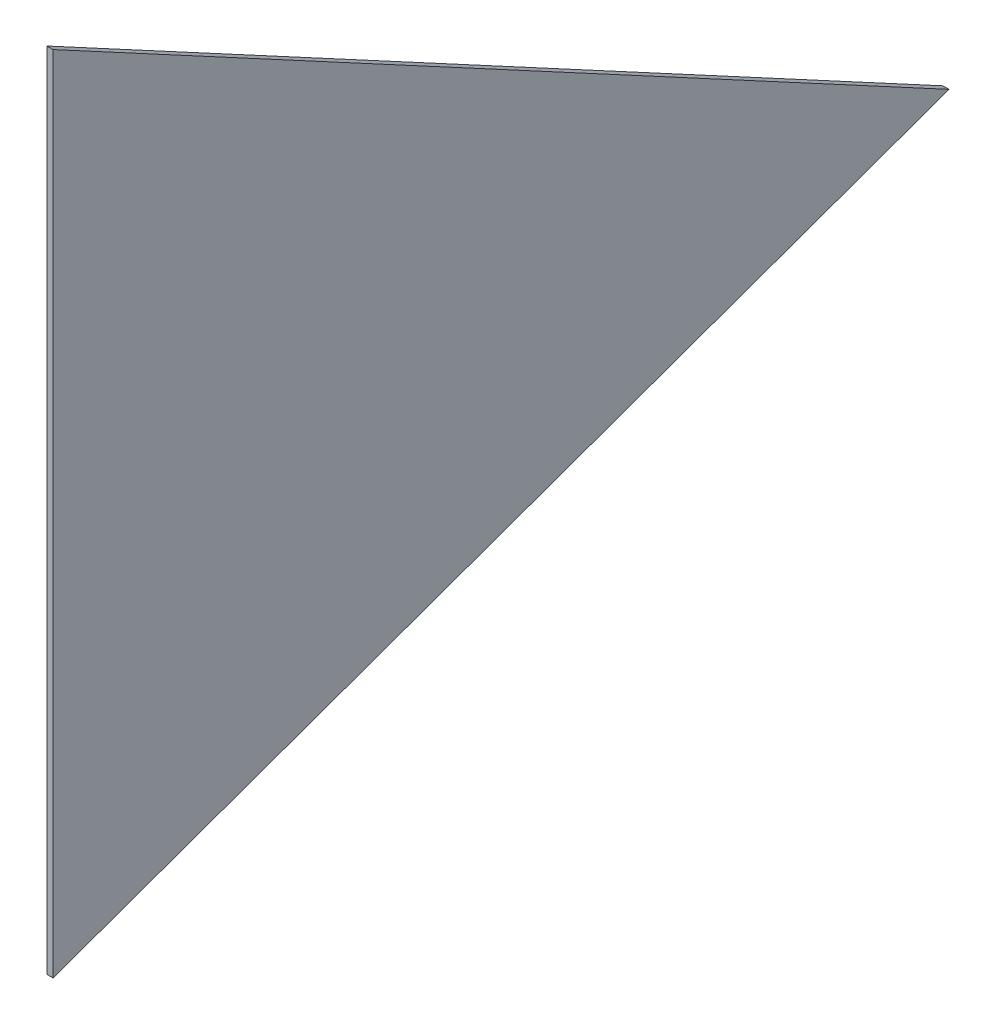
ISO-10303-21;
HEADER;
FILE_DESCRIPTION(('STEP AP214'),'2;1');
FILE_NAME('part.step','',(''),(''),'','','');
FILE_SCHEMA(('AUTOMOTIVE_DESIGN { 1 0 10303 214 1 1 1 1 }'));
ENDSEC;
DATA;
#1=APPLICATION_CONTEXT('core data for automotive mechanical design processes');
#2=APPLICATION_PROTOCOL_DEFINITION('international standard','automotive_design',2000,#1);
#3=PRODUCT_CONTEXT('',#1,'mechanical');
#4=PRODUCT('Part','Part','',(#3));
#5=PRODUCT_RELATED_PRODUCT_CATEGORY('part','',(#4));
#6=PRODUCT_DEFINITION_FORMATION('','',#4);
#7=PRODUCT_DEFINITION_CONTEXT('part definition',#1,'design');
#8=PRODUCT_DEFINITION('design','',#6,#7);
#9=PRODUCT_DEFINITION_SHAPE('','',#8);
#10=(LENGTH_UNIT() NAMED_UNIT(*) SI_UNIT(.MILLI.,.METRE.));
#11=(NAMED_UNIT(*) PLANE_ANGLE_UNIT() SI_UNIT($,.RADIAN.));
#12=(NAMED_UNIT(*) SI_UNIT($,.STERADIAN.) SOLID_ANGLE_UNIT());
#13=UNCERTAINTY_MEASURE_WITH_UNIT(LENGTH_MEASURE(1.E-05),#10,'distance_accuracy_value','');
#14=(GEOMETRIC_REPRESENTATION_CONTEXT(3) GLOBAL_UNCERTAINTY_ASSIGNED_CONTEXT((#13)) GLOBAL_UNIT_ASSIGNED_CONTEXT((#10,
#11,#12)) REPRESENTATION_CONTEXT('',''));
#15=CARTESIAN_POINT('',(0.,0.,0.));
#16=DIRECTION('',(0.,0.,1.));
#17=DIRECTION('',(1.,0.,0.));
#18=AXIS2_PLACEMENT_3D('',#15,#16,#17);
#19=CARTESIAN_POINT('',(62.000000910854,19.572443090784,1.252410666418));
#20=DIRECTION('',(-0.999999999999999,-4.371138864756E-08,0.));
#21=DIRECTION('',(4.371138864756E-08,-0.999999999999999,0.));
#22=AXIS2_PLACEMENT_3D('',#19,#20,#21);
#23=PLANE('',#22);
#24=DIRECTION('',(0.,0.474099798287788,0.880471113247606));
#25=VECTOR('',#24,1.);
#26=CARTESIAN_POINT('',(62.000000901818,19.779145232503,1.406827026589));
#27=LINE('',#26,#25);
#28=CARTESIAN_POINT('',(62.0000009060836,19.7791452324956,1.40682702657533));
#29=VERTEX_POINT('',#28);
#30=CARTESIAN_POINT('',(62.0000009094959,19.5449604773703,0.971912452076382));
#31=VERTEX_POINT('',#30);
#32=EDGE_CURVE('E52',#29,#31,#27,.F.);
#33=ORIENTED_EDGE('',*,*,#32,.F.);
#34=DIRECTION('',(0.,-1.,0.));
#35=VECTOR('',#34,1.);
#36=CARTESIAN_POINT('',(62.000000918879,19.388837307289,1.406827026589));
#37=LINE('',#36,#35);
#38=CARTESIAN_POINT('',(62.0000009171733,19.3888373072559,1.40682702658895));
#39=VERTEX_POINT('',#38);
#40=EDGE_CURVE('E53',#39,#29,#37,.F.);
#41=ORIENTED_EDGE('',*,*,#40,.F.);
#42=DIRECTION('',(0.,0.337864733454011,-0.94119467799603));
#43=VECTOR('',#42,1.);
#44=CARTESIAN_POINT('',(62.000000912055,19.544960477374,0.971912452066));
#45=LINE('',#44,#43);
#46=EDGE_CURVE('E20',#31,#39,#45,.F.);
#47=ORIENTED_EDGE('',*,*,#46,.F.);
#48=EDGE_LOOP('',(#33,#41,#47));
#49=FACE_BOUND('',#48,.T.);
#50=ADVANCED_FACE('F17',(#49),#23,.F.);
#51=CARTESIAN_POINT('',(62.000000912055,19.544960477374,0.971912452066));
#52=DIRECTION('',(4.11409263629013E-08,-0.941194677996029,-0.337864733454011));
#53=DIRECTION('',(0.,0.337864733454011,-0.94119467799603));
#54=AXIS2_PLACEMENT_3D('',#51,#52,#53);
#55=PLANE('',#54);
#56=DIRECTION('',(1.47685365804447E-08,-0.337864733454689,0.941194677995786));
#57=VECTOR('',#56,1.);
#58=CARTESIAN_POINT('',(61.9970009120553,19.544960477243,0.971912452066));
#59=LINE('',#58,#57);
#60=CARTESIAN_POINT('',(61.9970009154671,19.5449604772503,0.971912452079632));
#61=VERTEX_POINT('',#60);
#62=CARTESIAN_POINT('',(61.9970009146139,19.3888373071646,1.40682702656805));
#63=VERTEX_POINT('',#62);
#64=EDGE_CURVE('E60',#61,#63,#59,.T.);
#65=ORIENTED_EDGE('',*,*,#64,.F.);
#66=DIRECTION('',(0.999999999999999,3.38863527754038E-08,-1.82464964197069E-08));
#67=VECTOR('',#66,1.);
#68=CARTESIAN_POINT('',(62.000000901818,19.5449604773742,0.97191245206587));
#69=LINE('',#68,#67);
#70=EDGE_CURVE('E57',#31,#61,#69,.F.);
#71=ORIENTED_EDGE('',*,*,#70,.F.);
#72=ORIENTED_EDGE('',*,*,#46,.T.);
#73=DIRECTION('',(1.,0.,0.));
#74=VECTOR('',#73,1.);
#75=CARTESIAN_POINT('',(62.000000918879,19.388837307157,1.406827026589));
#76=LINE('',#75,#74);
#77=EDGE_CURVE('E64',#63,#39,#76,.T.);
#78=ORIENTED_EDGE('',*,*,#77,.F.);
#79=EDGE_LOOP('',(#65,#71,#72,#78));
#80=FACE_BOUND('',#79,.T.);
#81=ADVANCED_FACE('F58',(#80),#55,.T.);
#82=CARTESIAN_POINT('',(62.000000918879,19.388837307289,1.406827026589));
#83=DIRECTION('',(0.,0.,1.));
#84=DIRECTION('',(0.,-1.,0.));
#85=AXIS2_PLACEMENT_3D('',#82,#83,#84);
#86=PLANE('',#85);
#87=DIRECTION('',(4.371138864756E-08,-0.999999999999999,0.));
#88=VECTOR('',#87,1.);
#89=CARTESIAN_POINT('',(61.997000910854,19.572443090653,1.406827026589));
#90=LINE('',#89,#88);
#91=CARTESIAN_POINT('',(61.9970009043774,19.7791452324375,1.40682702658901));
#92=VERTEX_POINT('',#91);
#93=EDGE_CURVE('E26',#63,#92,#90,.F.);
#94=ORIENTED_EDGE('',*,*,#93,.F.);
#95=ORIENTED_EDGE('',*,*,#77,.T.);
#96=ORIENTED_EDGE('',*,*,#40,.T.);
#97=DIRECTION('',(0.999999999999999,3.38863527754038E-08,-1.82464964197069E-08));
#98=VECTOR('',#97,1.);
#99=CARTESIAN_POINT('',(62.000000901818,19.7791452324736,1.40682702653432));
#100=LINE('',#99,#98);
#101=EDGE_CURVE('E35',#92,#29,#100,.T.);
#102=ORIENTED_EDGE('',*,*,#101,.F.);
#103=EDGE_LOOP('',(#94,#95,#96,#102));
#104=FACE_BOUND('',#103,.T.);
#105=ADVANCED_FACE('F68',(#104),#86,.T.);
#106=CARTESIAN_POINT('',(62.000000901818,19.779145232503,1.406827026589));
#107=DIRECTION('',(-3.84866150241028E-08,0.880471113247606,-0.474099798287788));
#108=DIRECTION('',(0.,0.474099798287788,0.880471113247606));
#109=AXIS2_PLACEMENT_3D('',#106,#107,#108);
#110=PLANE('',#109);
#111=DIRECTION('',(2.07235604089494E-08,-0.474099798288277,-0.880471113247342));
#112=VECTOR('',#111,1.);
#113=CARTESIAN_POINT('',(61.9970009018188,19.779145232372,1.406827026589));
#114=LINE('',#113,#112);
#115=EDGE_CURVE('E11',#92,#61,#114,.T.);
#116=ORIENTED_EDGE('',*,*,#115,.F.);
#117=ORIENTED_EDGE('',*,*,#101,.T.);
#118=ORIENTED_EDGE('',*,*,#32,.T.);
#119=ORIENTED_EDGE('',*,*,#70,.T.);
#120=EDGE_LOOP('',(#116,#117,#118,#119));
#121=FACE_BOUND('',#120,.T.);
#122=ADVANCED_FACE('F63',(#121),#110,.T.);
#123=CARTESIAN_POINT('',(61.997000910854,19.572443090653,1.252410666418));
#124=DIRECTION('',(-0.999999999999999,-4.371138864756E-08,0.));
#125=DIRECTION('',(4.371138864756E-08,-0.999999999999999,0.));
#126=AXIS2_PLACEMENT_3D('',#123,#124,#125);
#127=PLANE('',#126);
#128=ORIENTED_EDGE('',*,*,#93,.T.);
#129=ORIENTED_EDGE('',*,*,#115,.T.);
#130=ORIENTED_EDGE('',*,*,#64,.T.);
#131=EDGE_LOOP('',(#128,#129,#130));
#132=FACE_BOUND('',#131,.T.);
#133=ADVANCED_FACE('F72',(#132),#127,.T.);
#134=CLOSED_SHELL('',(#50,#81,#105,#122,#133));
#135=MANIFOLD_SOLID_BREP('B1',#134);
#136=ADVANCED_BREP_SHAPE_REPRESENTATION('',(#18,#135),#14);
#137=SHAPE_DEFINITION_REPRESENTATION(#9,#136);
ENDSEC;
END-ISO-10303-21;
